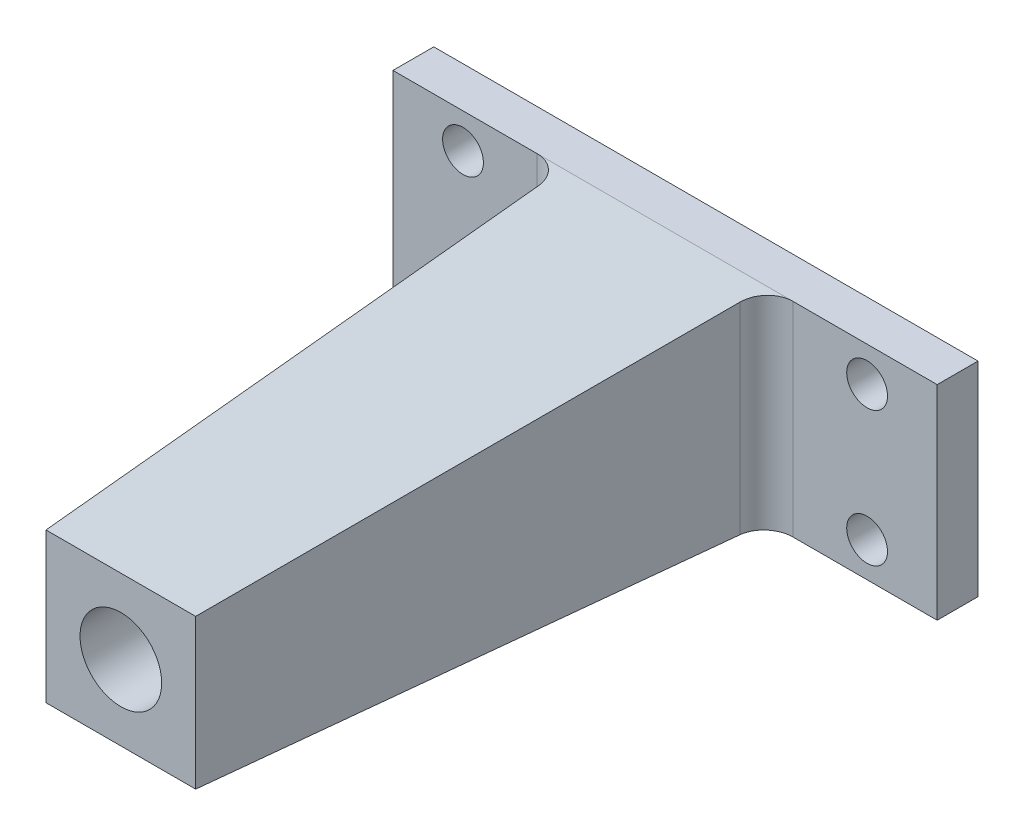
ISO-10303-21;
HEADER;
FILE_DESCRIPTION(('STEP AP214'),'2;1');
FILE_NAME('part.step','',(''),(''),'','','');
FILE_SCHEMA(('AUTOMOTIVE_DESIGN { 1 0 10303 214 1 1 1 1 }'));
ENDSEC;
DATA;
#1=APPLICATION_CONTEXT('core data for automotive mechanical design processes');
#2=APPLICATION_PROTOCOL_DEFINITION('international standard','automotive_design',2000,#1);
#3=PRODUCT_CONTEXT('',#1,'mechanical');
#4=PRODUCT('Part','Part','',(#3));
#5=PRODUCT_RELATED_PRODUCT_CATEGORY('part','',(#4));
#6=PRODUCT_DEFINITION_FORMATION('','',#4);
#7=PRODUCT_DEFINITION_CONTEXT('part definition',#1,'design');
#8=PRODUCT_DEFINITION('design','',#6,#7);
#9=PRODUCT_DEFINITION_SHAPE('','',#8);
#10=(LENGTH_UNIT() NAMED_UNIT(*) SI_UNIT(.MILLI.,.METRE.));
#11=(NAMED_UNIT(*) PLANE_ANGLE_UNIT() SI_UNIT($,.RADIAN.));
#12=(NAMED_UNIT(*) SI_UNIT($,.STERADIAN.) SOLID_ANGLE_UNIT());
#13=UNCERTAINTY_MEASURE_WITH_UNIT(LENGTH_MEASURE(1.E-05),#10,'distance_accuracy_value','');
#14=(GEOMETRIC_REPRESENTATION_CONTEXT(3) GLOBAL_UNCERTAINTY_ASSIGNED_CONTEXT((#13)) GLOBAL_UNIT_ASSIGNED_CONTEXT((#10,
#11,#12)) REPRESENTATION_CONTEXT('',''));
#15=CARTESIAN_POINT('',(0.,0.,0.));
#16=DIRECTION('',(0.,0.,1.));
#17=DIRECTION('',(1.,0.,0.));
#18=AXIS2_PLACEMENT_3D('',#15,#16,#17);
#19=CARTESIAN_POINT('',(0.,0.,3.));
#20=DIRECTION('',(0.,0.,-1.));
#21=DIRECTION('',(-1.,0.,0.));
#22=AXIS2_PLACEMENT_3D('',#19,#20,#21);
#23=PLANE('',#22);
#24=CARTESIAN_POINT('',(14.8489898729813,4.94949493640241,3.));
#25=DIRECTION('',(0.,0.,-1.));
#26=DIRECTION('',(-1.,0.,0.));
#27=AXIS2_PLACEMENT_3D('',#24,#25,#26);
#28=CIRCLE('',#27,1.5);
#29=CARTESIAN_POINT('',(13.3489898729813,4.94949493640241,3.));
#30=VERTEX_POINT('',#29);
#31=EDGE_CURVE('E708',#30,#30,#28,.T.);
#32=ORIENTED_EDGE('',*,*,#31,.T.);
#33=EDGE_LOOP('',(#32));
#34=FACE_BOUND('',#33,.T.);
#35=CARTESIAN_POINT('',(14.8489898729813,-4.95000000020931,3.));
#36=DIRECTION('',(0.,0.,-1.));
#37=DIRECTION('',(-1.,0.,0.));
#38=AXIS2_PLACEMENT_3D('',#35,#36,#37);
#39=CIRCLE('',#38,1.5);
#40=CARTESIAN_POINT('',(13.3489898729813,-4.95000000020931,3.));
#41=VERTEX_POINT('',#40);
#42=EDGE_CURVE('E717',#41,#41,#39,.T.);
#43=ORIENTED_EDGE('',*,*,#42,.T.);
#44=EDGE_LOOP('',(#43));
#45=FACE_BOUND('',#44,.T.);
#46=DIRECTION('',(-1.,0.,0.));
#47=VECTOR('',#46,1.);
#48=CARTESIAN_POINT('',(-20.,7.5,3.));
#49=LINE('',#48,#47);
#50=CARTESIAN_POINT('',(20.,7.5,3.));
#51=VERTEX_POINT('',#50);
#52=CARTESIAN_POINT('',(9.40249843945008,7.5,3.));
#53=VERTEX_POINT('',#52);
#54=EDGE_CURVE('E233',#51,#53,#49,.T.);
#55=ORIENTED_EDGE('',*,*,#54,.T.);
#56=DIRECTION('',(0.,1.,0.));
#57=VECTOR('',#56,1.);
#58=CARTESIAN_POINT('',(9.40249843945008,0.,3.));
#59=LINE('',#58,#57);
#60=CARTESIAN_POINT('',(9.40249843945008,-7.5,3.));
#61=VERTEX_POINT('',#60);
#62=EDGE_CURVE('E252',#53,#61,#59,.F.);
#63=ORIENTED_EDGE('',*,*,#62,.T.);
#64=DIRECTION('',(1.,0.,0.));
#65=VECTOR('',#64,1.);
#66=CARTESIAN_POINT('',(-20.,-7.5,3.));
#67=LINE('',#66,#65);
#68=CARTESIAN_POINT('',(20.,-7.5,3.));
#69=VERTEX_POINT('',#68);
#70=EDGE_CURVE('E242',#61,#69,#67,.T.);
#71=ORIENTED_EDGE('',*,*,#70,.T.);
#72=DIRECTION('',(0.,1.,0.));
#73=VECTOR('',#72,1.);
#74=CARTESIAN_POINT('',(20.,-7.5,3.));
#75=LINE('',#74,#73);
#76=EDGE_CURVE('E219',#69,#51,#75,.T.);
#77=ORIENTED_EDGE('',*,*,#76,.T.);
#78=EDGE_LOOP('',(#55,#63,#71,#77));
#79=FACE_BOUND('',#78,.T.);
#80=ADVANCED_FACE('F48',(#34,#45,#79),#23,.F.);
#81=CARTESIAN_POINT('',(-14.8494949368536,-4.9500000002094,3.));
#82=DIRECTION('',(0.,0.,-1.));
#83=DIRECTION('',(-1.,0.,0.));
#84=AXIS2_PLACEMENT_3D('',#81,#82,#83);
#85=CIRCLE('',#84,1.5);
#86=CARTESIAN_POINT('',(-16.3494949368536,-4.9500000002094,3.));
#87=VERTEX_POINT('',#86);
#88=EDGE_CURVE('E702',#87,#87,#85,.T.);
#89=ORIENTED_EDGE('',*,*,#88,.T.);
#90=EDGE_LOOP('',(#89));
#91=FACE_BOUND('',#90,.T.);
#92=CARTESIAN_POINT('',(-14.8494949368536,4.94949493640231,3.));
#93=DIRECTION('',(0.,0.,-1.));
#94=DIRECTION('',(-1.,0.,0.));
#95=AXIS2_PLACEMENT_3D('',#92,#93,#94);
#96=CIRCLE('',#95,1.49999999999999);
#97=CARTESIAN_POINT('',(-16.3494949368536,4.94949493640231,3.));
#98=VERTEX_POINT('',#97);
#99=EDGE_CURVE('E704',#98,#98,#96,.T.);
#100=ORIENTED_EDGE('',*,*,#99,.T.);
#101=EDGE_LOOP('',(#100));
#102=FACE_BOUND('',#101,.T.);
#103=CARTESIAN_POINT('',(-20.,-7.5,3.));
#104=VERTEX_POINT('',#103);
#105=CARTESIAN_POINT('',(-9.40249843945008,-7.5,3.));
#106=VERTEX_POINT('',#105);
#107=EDGE_CURVE('E239',#104,#106,#67,.T.);
#108=ORIENTED_EDGE('',*,*,#107,.T.);
#109=DIRECTION('',(0.,-1.,0.));
#110=VECTOR('',#109,1.);
#111=CARTESIAN_POINT('',(-9.40249843945008,0.,3.));
#112=LINE('',#111,#110);
#113=CARTESIAN_POINT('',(-9.40249843945008,7.5,3.));
#114=VERTEX_POINT('',#113);
#115=EDGE_CURVE('E256',#106,#114,#112,.F.);
#116=ORIENTED_EDGE('',*,*,#115,.T.);
#117=CARTESIAN_POINT('',(-20.,7.5,3.));
#118=VERTEX_POINT('',#117);
#119=EDGE_CURVE('E222',#114,#118,#49,.T.);
#120=ORIENTED_EDGE('',*,*,#119,.T.);
#121=DIRECTION('',(0.,-1.,0.));
#122=VECTOR('',#121,1.);
#123=CARTESIAN_POINT('',(-20.,-7.5,3.));
#124=LINE('',#123,#122);
#125=EDGE_CURVE('E226',#118,#104,#124,.T.);
#126=ORIENTED_EDGE('',*,*,#125,.T.);
#127=EDGE_LOOP('',(#108,#116,#120,#126));
#128=FACE_BOUND('',#127,.T.);
#129=ADVANCED_FACE('F358',(#91,#102,#128),#23,.F.);
#130=CARTESIAN_POINT('',(0.,0.,0.));
#131=DIRECTION('',(0.,0.,-1.));
#132=DIRECTION('',(-1.,0.,0.));
#133=AXIS2_PLACEMENT_3D('',#130,#131,#132);
#134=PLANE('',#133);
#135=CARTESIAN_POINT('',(-14.8494949368536,-4.9500000002094,0.));
#136=DIRECTION('',(0.,0.,-1.));
#137=DIRECTION('',(-1.,0.,0.));
#138=AXIS2_PLACEMENT_3D('',#135,#136,#137);
#139=CIRCLE('',#138,1.5);
#140=CARTESIAN_POINT('',(-16.3494949368536,-4.9500000002094,0.));
#141=VERTEX_POINT('',#140);
#142=EDGE_CURVE('E699',#141,#141,#139,.T.);
#143=ORIENTED_EDGE('',*,*,#142,.F.);
#144=EDGE_LOOP('',(#143));
#145=FACE_BOUND('',#144,.T.);
#146=CARTESIAN_POINT('',(-14.8494949368536,4.94949493640231,0.));
#147=DIRECTION('',(0.,0.,-1.));
#148=DIRECTION('',(-1.,0.,0.));
#149=AXIS2_PLACEMENT_3D('',#146,#147,#148);
#150=CIRCLE('',#149,1.49999999999999);
#151=CARTESIAN_POINT('',(-16.3494949368536,4.94949493640231,0.));
#152=VERTEX_POINT('',#151);
#153=EDGE_CURVE('E725',#152,#152,#150,.T.);
#154=ORIENTED_EDGE('',*,*,#153,.F.);
#155=EDGE_LOOP('',(#154));
#156=FACE_BOUND('',#155,.T.);
#157=CARTESIAN_POINT('',(14.8489898729813,4.94949493640241,0.));
#158=DIRECTION('',(0.,0.,-1.));
#159=DIRECTION('',(-1.,0.,0.));
#160=AXIS2_PLACEMENT_3D('',#157,#158,#159);
#161=CIRCLE('',#160,1.5);
#162=CARTESIAN_POINT('',(13.3489898729813,4.94949493640241,0.));
#163=VERTEX_POINT('',#162);
#164=EDGE_CURVE('E723',#163,#163,#161,.T.);
#165=ORIENTED_EDGE('',*,*,#164,.F.);
#166=EDGE_LOOP('',(#165));
#167=FACE_BOUND('',#166,.T.);
#168=CARTESIAN_POINT('',(14.8489898729813,-4.95000000020931,0.));
#169=DIRECTION('',(0.,0.,-1.));
#170=DIRECTION('',(-1.,0.,0.));
#171=AXIS2_PLACEMENT_3D('',#168,#169,#170);
#172=CIRCLE('',#171,1.5);
#173=CARTESIAN_POINT('',(13.3489898729813,-4.95000000020931,0.));
#174=VERTEX_POINT('',#173);
#175=EDGE_CURVE('E720',#174,#174,#172,.T.);
#176=ORIENTED_EDGE('',*,*,#175,.F.);
#177=EDGE_LOOP('',(#176));
#178=FACE_BOUND('',#177,.T.);
#179=CARTESIAN_POINT('',(-4.95,-4.95,0.));
#180=DIRECTION('',(0.,0.,1.));
#181=DIRECTION('',(1.,0.,0.));
#182=AXIS2_PLACEMENT_3D('',#179,#180,#181);
#183=CIRCLE('',#182,1.5);
#184=CARTESIAN_POINT('',(-3.45,-4.95,0.));
#185=VERTEX_POINT('',#184);
#186=EDGE_CURVE('E209',#185,#185,#183,.T.);
#187=ORIENTED_EDGE('',*,*,#186,.T.);
#188=EDGE_LOOP('',(#187));
#189=FACE_BOUND('',#188,.T.);
#190=CARTESIAN_POINT('',(4.95,4.95,0.));
#191=DIRECTION('',(0.,0.,1.));
#192=DIRECTION('',(1.,0.,0.));
#193=AXIS2_PLACEMENT_3D('',#190,#191,#192);
#194=CIRCLE('',#193,1.5);
#195=CARTESIAN_POINT('',(6.45,4.95,0.));
#196=VERTEX_POINT('',#195);
#197=EDGE_CURVE('E215',#196,#196,#194,.T.);
#198=ORIENTED_EDGE('',*,*,#197,.T.);
#199=EDGE_LOOP('',(#198));
#200=FACE_BOUND('',#199,.T.);
#201=DIRECTION('',(0.,1.,0.));
#202=VECTOR('',#201,1.);
#203=CARTESIAN_POINT('',(20.,-7.5,0.));
#204=LINE('',#203,#202);
#205=CARTESIAN_POINT('',(20.,-7.5,0.));
#206=VERTEX_POINT('',#205);
#207=CARTESIAN_POINT('',(20.,7.5,0.));
#208=VERTEX_POINT('',#207);
#209=EDGE_CURVE('E218',#206,#208,#204,.T.);
#210=ORIENTED_EDGE('',*,*,#209,.F.);
#211=DIRECTION('',(1.,0.,0.));
#212=VECTOR('',#211,1.);
#213=CARTESIAN_POINT('',(-20.,-7.5,0.));
#214=LINE('',#213,#212);
#215=CARTESIAN_POINT('',(-20.,-7.5,0.));
#216=VERTEX_POINT('',#215);
#217=EDGE_CURVE('E223',#216,#206,#214,.T.);
#218=ORIENTED_EDGE('',*,*,#217,.F.);
#219=DIRECTION('',(0.,-1.,0.));
#220=VECTOR('',#219,1.);
#221=CARTESIAN_POINT('',(-20.,-7.5,0.));
#222=LINE('',#221,#220);
#223=CARTESIAN_POINT('',(-20.,7.5,0.));
#224=VERTEX_POINT('',#223);
#225=EDGE_CURVE('E344',#224,#216,#222,.T.);
#226=ORIENTED_EDGE('',*,*,#225,.F.);
#227=DIRECTION('',(-1.,0.,0.));
#228=VECTOR('',#227,1.);
#229=CARTESIAN_POINT('',(-20.,7.5,0.));
#230=LINE('',#229,#228);
#231=EDGE_CURVE('E345',#208,#224,#230,.T.);
#232=ORIENTED_EDGE('',*,*,#231,.F.);
#233=EDGE_LOOP('',(#210,#218,#226,#232));
#234=FACE_BOUND('',#233,.T.);
#235=CARTESIAN_POINT('',(4.95,-4.95,0.));
#236=DIRECTION('',(0.,0.,1.));
#237=DIRECTION('',(1.,0.,0.));
#238=AXIS2_PLACEMENT_3D('',#235,#236,#237);
#239=CIRCLE('',#238,1.5);
#240=CARTESIAN_POINT('',(6.45,-4.95,0.));
#241=VERTEX_POINT('',#240);
#242=EDGE_CURVE('E212',#241,#241,#239,.T.);
#243=ORIENTED_EDGE('',*,*,#242,.T.);
#244=EDGE_LOOP('',(#243));
#245=FACE_BOUND('',#244,.T.);
#246=CARTESIAN_POINT('',(-4.95,4.95,0.));
#247=DIRECTION('',(0.,0.,1.));
#248=DIRECTION('',(1.,0.,0.));
#249=AXIS2_PLACEMENT_3D('',#246,#247,#248);
#250=CIRCLE('',#249,1.5);
#251=CARTESIAN_POINT('',(-3.45,4.95,0.));
#252=VERTEX_POINT('',#251);
#253=EDGE_CURVE('E201',#252,#252,#250,.T.);
#254=ORIENTED_EDGE('',*,*,#253,.T.);
#255=EDGE_LOOP('',(#254));
#256=FACE_BOUND('',#255,.T.);
#257=ADVANCED_FACE('F353',(#145,#156,#167,#178,#189,#200,#234,#245,#256),#134,.T.);
#258=CARTESIAN_POINT('',(20.,-7.5,3.));
#259=DIRECTION('',(-1.,0.,0.));
#260=DIRECTION('',(0.,0.,1.));
#261=AXIS2_PLACEMENT_3D('',#258,#259,#260);
#262=PLANE('',#261);
#263=ORIENTED_EDGE('',*,*,#209,.T.);
#264=DIRECTION('',(0.,0.,-1.));
#265=VECTOR('',#264,1.);
#266=CARTESIAN_POINT('',(20.,7.5,3.));
#267=LINE('',#266,#265);
#268=EDGE_CURVE('E237',#51,#208,#267,.T.);
#269=ORIENTED_EDGE('',*,*,#268,.F.);
#270=ORIENTED_EDGE('',*,*,#76,.F.);
#271=DIRECTION('',(0.,0.,-1.));
#272=VECTOR('',#271,1.);
#273=CARTESIAN_POINT('',(20.,-7.5,3.));
#274=LINE('',#273,#272);
#275=EDGE_CURVE('E241',#69,#206,#274,.T.);
#276=ORIENTED_EDGE('',*,*,#275,.T.);
#277=EDGE_LOOP('',(#263,#269,#270,#276));
#278=FACE_BOUND('',#277,.T.);
#279=ADVANCED_FACE('F348',(#278),#262,.F.);
#280=CARTESIAN_POINT('',(-20.,7.5,3.));
#281=DIRECTION('',(0.,-1.,0.));
#282=DIRECTION('',(0.,0.,-1.));
#283=AXIS2_PLACEMENT_3D('',#280,#281,#282);
#284=PLANE('',#283);
#285=ORIENTED_EDGE('',*,*,#231,.T.);
#286=DIRECTION('',(0.,0.,-1.));
#287=VECTOR('',#286,1.);
#288=CARTESIAN_POINT('',(-20.,7.5,3.));
#289=LINE('',#288,#287);
#290=EDGE_CURVE('E328',#118,#224,#289,.T.);
#291=ORIENTED_EDGE('',*,*,#290,.F.);
#292=ORIENTED_EDGE('',*,*,#119,.F.);
#293=DIRECTION('',(-1.,0.,0.));
#294=VECTOR('',#293,1.);
#295=CARTESIAN_POINT('',(-7.5,7.5,3.));
#296=LINE('',#295,#294);
#297=EDGE_CURVE('E132',#53,#114,#296,.T.);
#298=ORIENTED_EDGE('',*,*,#297,.F.);
#299=ORIENTED_EDGE('',*,*,#54,.F.);
#300=ORIENTED_EDGE('',*,*,#268,.T.);
#301=EDGE_LOOP('',(#285,#291,#292,#298,#299,#300));
#302=FACE_BOUND('',#301,.T.);
#303=ADVANCED_FACE('F359',(#302),#284,.F.);
#304=CARTESIAN_POINT('',(-20.,-7.5,3.));
#305=DIRECTION('',(1.,0.,0.));
#306=DIRECTION('',(0.,0.,-1.));
#307=AXIS2_PLACEMENT_3D('',#304,#305,#306);
#308=PLANE('',#307);
#309=ORIENTED_EDGE('',*,*,#225,.T.);
#310=DIRECTION('',(0.,0.,-1.));
#311=VECTOR('',#310,1.);
#312=CARTESIAN_POINT('',(-20.,-7.5,3.));
#313=LINE('',#312,#311);
#314=EDGE_CURVE('E333',#104,#216,#313,.T.);
#315=ORIENTED_EDGE('',*,*,#314,.F.);
#316=ORIENTED_EDGE('',*,*,#125,.F.);
#317=ORIENTED_EDGE('',*,*,#290,.T.);
#318=EDGE_LOOP('',(#309,#315,#316,#317));
#319=FACE_BOUND('',#318,.T.);
#320=ADVANCED_FACE('F356',(#319),#308,.F.);
#321=CARTESIAN_POINT('',(-20.,-7.5,3.));
#322=DIRECTION('',(0.,1.,0.));
#323=DIRECTION('',(0.,0.,1.));
#324=AXIS2_PLACEMENT_3D('',#321,#322,#323);
#325=PLANE('',#324);
#326=ORIENTED_EDGE('',*,*,#217,.T.);
#327=ORIENTED_EDGE('',*,*,#275,.F.);
#328=ORIENTED_EDGE('',*,*,#70,.F.);
#329=DIRECTION('',(1.,0.,0.));
#330=VECTOR('',#329,1.);
#331=CARTESIAN_POINT('',(-7.5,-7.5,3.));
#332=LINE('',#331,#330);
#333=EDGE_CURVE('E64',#106,#61,#332,.T.);
#334=ORIENTED_EDGE('',*,*,#333,.F.);
#335=ORIENTED_EDGE('',*,*,#107,.F.);
#336=ORIENTED_EDGE('',*,*,#314,.T.);
#337=EDGE_LOOP('',(#326,#327,#328,#334,#335,#336));
#338=FACE_BOUND('',#337,.T.);
#339=ADVANCED_FACE('F357',(#338),#325,.F.);
#340=CARTESIAN_POINT('',(4.95,4.95,3.));
#341=DIRECTION('',(0.,0.,-1.));
#342=DIRECTION('',(-1.,0.,0.));
#343=AXIS2_PLACEMENT_3D('',#340,#341,#342);
#344=CYLINDRICAL_SURFACE('',#343,1.5);
#345=ORIENTED_EDGE('',*,*,#197,.F.);
#346=EDGE_LOOP('',(#345));
#347=FACE_BOUND('',#346,.T.);
#348=CARTESIAN_POINT('',(4.95,4.95,8.));
#349=DIRECTION('',(0.,0.,-1.));
#350=DIRECTION('',(-1.,0.,0.));
#351=AXIS2_PLACEMENT_3D('',#348,#349,#350);
#352=CIRCLE('',#351,1.5);
#353=CARTESIAN_POINT('',(3.45,4.95,8.));
#354=VERTEX_POINT('',#353);
#355=EDGE_CURVE('E399',#354,#354,#352,.T.);
#356=ORIENTED_EDGE('',*,*,#355,.F.);
#357=EDGE_LOOP('',(#356));
#358=FACE_BOUND('',#357,.T.);
#359=ADVANCED_FACE('F379',(#347,#358),#344,.F.);
#360=CARTESIAN_POINT('',(4.95,-4.95,3.));
#361=DIRECTION('',(0.,0.,-1.));
#362=DIRECTION('',(-1.,0.,0.));
#363=AXIS2_PLACEMENT_3D('',#360,#361,#362);
#364=CYLINDRICAL_SURFACE('',#363,1.5);
#365=ORIENTED_EDGE('',*,*,#242,.F.);
#366=EDGE_LOOP('',(#365));
#367=FACE_BOUND('',#366,.T.);
#368=CARTESIAN_POINT('',(4.95,-4.95,8.));
#369=DIRECTION('',(0.,0.,-1.));
#370=DIRECTION('',(-1.,0.,0.));
#371=AXIS2_PLACEMENT_3D('',#368,#369,#370);
#372=CIRCLE('',#371,1.5);
#373=CARTESIAN_POINT('',(3.45,-4.95,8.));
#374=VERTEX_POINT('',#373);
#375=EDGE_CURVE('E402',#374,#374,#372,.T.);
#376=ORIENTED_EDGE('',*,*,#375,.F.);
#377=EDGE_LOOP('',(#376));
#378=FACE_BOUND('',#377,.T.);
#379=ADVANCED_FACE('F388',(#367,#378),#364,.F.);
#380=CARTESIAN_POINT('',(-4.95,-4.95,3.));
#381=DIRECTION('',(0.,0.,-1.));
#382=DIRECTION('',(-1.,0.,0.));
#383=AXIS2_PLACEMENT_3D('',#380,#381,#382);
#384=CYLINDRICAL_SURFACE('',#383,1.5);
#385=ORIENTED_EDGE('',*,*,#186,.F.);
#386=EDGE_LOOP('',(#385));
#387=FACE_BOUND('',#386,.T.);
#388=CARTESIAN_POINT('',(-4.95,-4.95,8.));
#389=DIRECTION('',(0.,0.,-1.));
#390=DIRECTION('',(-1.,0.,0.));
#391=AXIS2_PLACEMENT_3D('',#388,#389,#390);
#392=CIRCLE('',#391,1.5);
#393=CARTESIAN_POINT('',(-6.45,-4.95,8.));
#394=VERTEX_POINT('',#393);
#395=EDGE_CURVE('E405',#394,#394,#392,.T.);
#396=ORIENTED_EDGE('',*,*,#395,.F.);
#397=EDGE_LOOP('',(#396));
#398=FACE_BOUND('',#397,.T.);
#399=ADVANCED_FACE('F393',(#387,#398),#384,.F.);
#400=CARTESIAN_POINT('',(-4.95,4.95,3.));
#401=DIRECTION('',(0.,0.,-1.));
#402=DIRECTION('',(-1.,0.,0.));
#403=AXIS2_PLACEMENT_3D('',#400,#401,#402);
#404=CYLINDRICAL_SURFACE('',#403,1.5);
#405=ORIENTED_EDGE('',*,*,#253,.F.);
#406=EDGE_LOOP('',(#405));
#407=FACE_BOUND('',#406,.T.);
#408=CARTESIAN_POINT('',(-4.95,4.95,8.));
#409=DIRECTION('',(0.,0.,-1.));
#410=DIRECTION('',(-1.,0.,0.));
#411=AXIS2_PLACEMENT_3D('',#408,#409,#410);
#412=CIRCLE('',#411,1.5);
#413=CARTESIAN_POINT('',(-6.45,4.95,8.));
#414=VERTEX_POINT('',#413);
#415=EDGE_CURVE('E401',#414,#414,#412,.T.);
#416=ORIENTED_EDGE('',*,*,#415,.F.);
#417=EDGE_LOOP('',(#416));
#418=FACE_BOUND('',#417,.T.);
#419=ADVANCED_FACE('F417',(#407,#418),#404,.F.);
#420=CARTESIAN_POINT('',(0.,7.63092269326683,0.381546134663342));
#421=DIRECTION('',(0.,0.998752338877845,0.0499376169438922));
#422=DIRECTION('',(0.,-0.0499376169438922,0.998752338877845));
#423=AXIS2_PLACEMENT_3D('',#420,#421,#422);
#424=PLANE('',#423);
#425=DIRECTION('',(0.0498754668053816,0.0498754668053816,-0.997509336107633));
#426=VECTOR('',#425,1.);
#427=CARTESIAN_POINT('',(5.5,5.5,43.));
#428=LINE('',#427,#426);
#429=CARTESIAN_POINT('',(5.5,5.5,43.));
#430=VERTEX_POINT('',#429);
#431=CARTESIAN_POINT('',(7.40499376169439,7.40499376169439,4.90012476611222));
#432=VERTEX_POINT('',#431);
#433=EDGE_CURVE('E120',#430,#432,#428,.T.);
#434=ORIENTED_EDGE('',*,*,#433,.T.);
#435=CARTESIAN_POINT('',(9.40249843945008,7.4,5.));
#436=DIRECTION('',(0.,0.998752338877845,0.0499376169438922));
#437=DIRECTION('',(0.,0.0499376169438922,-0.998752338877845));
#438=AXIS2_PLACEMENT_3D('',#435,#436,#437);
#439=ELLIPSE('',#438,2.00249843945008,2.);
#440=EDGE_CURVE('E262',#432,#53,#439,.F.);
#441=ORIENTED_EDGE('',*,*,#440,.T.);
#442=ORIENTED_EDGE('',*,*,#297,.T.);
#443=CARTESIAN_POINT('',(-9.40249843945008,7.4,5.));
#444=DIRECTION('',(0.,0.998752338877845,0.0499376169438922));
#445=DIRECTION('',(0.,-0.0499376169438922,0.998752338877845));
#446=AXIS2_PLACEMENT_3D('',#443,#444,#445);
#447=ELLIPSE('',#446,2.00249843945008,2.);
#448=CARTESIAN_POINT('',(-7.40499376169439,7.40499376169439,4.90012476611222));
#449=VERTEX_POINT('',#448);
#450=EDGE_CURVE('E12',#114,#449,#447,.F.);
#451=ORIENTED_EDGE('',*,*,#450,.T.);
#452=DIRECTION('',(-0.0498754668053816,0.0498754668053816,-0.997509336107633));
#453=VECTOR('',#452,1.);
#454=CARTESIAN_POINT('',(-5.5,5.5,43.));
#455=LINE('',#454,#453);
#456=CARTESIAN_POINT('',(-5.5,5.5,43.));
#457=VERTEX_POINT('',#456);
#458=EDGE_CURVE('E133',#457,#449,#455,.T.);
#459=ORIENTED_EDGE('',*,*,#458,.F.);
#460=DIRECTION('',(-1.,0.,0.));
#461=VECTOR('',#460,1.);
#462=CARTESIAN_POINT('',(5.5,5.5,43.));
#463=LINE('',#462,#461);
#464=EDGE_CURVE('E136',#430,#457,#463,.T.);
#465=ORIENTED_EDGE('',*,*,#464,.F.);
#466=EDGE_LOOP('',(#434,#441,#442,#451,#459,#465));
#467=FACE_BOUND('',#466,.T.);
#468=ADVANCED_FACE('F138',(#467),#424,.T.);
#469=CARTESIAN_POINT('',(-7.63092269326684,0.,0.381546134663342));
#470=DIRECTION('',(-0.998752338877845,0.,0.0499376169438922));
#471=DIRECTION('',(0.0499376169438922,0.,0.998752338877845));
#472=AXIS2_PLACEMENT_3D('',#469,#470,#471);
#473=PLANE('',#472);
#474=ORIENTED_EDGE('',*,*,#458,.T.);
#475=DIRECTION('',(0.,-1.,0.));
#476=VECTOR('',#475,1.);
#477=CARTESIAN_POINT('',(-7.40499376169439,0.,4.90012476611222));
#478=LINE('',#477,#476);
#479=CARTESIAN_POINT('',(-7.40499376169439,-7.40499376169439,4.90012476611222));
#480=VERTEX_POINT('',#479);
#481=EDGE_CURVE('E254',#449,#480,#478,.T.);
#482=ORIENTED_EDGE('',*,*,#481,.T.);
#483=DIRECTION('',(-0.0498754668053816,-0.0498754668053816,-0.997509336107633));
#484=VECTOR('',#483,1.);
#485=CARTESIAN_POINT('',(-5.5,-5.5,43.));
#486=LINE('',#485,#484);
#487=CARTESIAN_POINT('',(-5.5,-5.5,43.));
#488=VERTEX_POINT('',#487);
#489=EDGE_CURVE('E144',#488,#480,#486,.T.);
#490=ORIENTED_EDGE('',*,*,#489,.F.);
#491=DIRECTION('',(0.,-1.,0.));
#492=VECTOR('',#491,1.);
#493=CARTESIAN_POINT('',(-5.5,5.5,43.));
#494=LINE('',#493,#492);
#495=EDGE_CURVE('E196',#457,#488,#494,.T.);
#496=ORIENTED_EDGE('',*,*,#495,.F.);
#497=EDGE_LOOP('',(#474,#482,#490,#496));
#498=FACE_BOUND('',#497,.T.);
#499=ADVANCED_FACE('F274',(#498),#473,.T.);
#500=CARTESIAN_POINT('',(7.63092269326684,0.,0.381546134663342));
#501=DIRECTION('',(0.998752338877845,0.,0.0499376169438922));
#502=DIRECTION('',(0.0499376169438922,0.,-0.998752338877845));
#503=AXIS2_PLACEMENT_3D('',#500,#501,#502);
#504=PLANE('',#503);
#505=DIRECTION('',(0.0498754668053816,-0.0498754668053816,-0.997509336107633));
#506=VECTOR('',#505,1.);
#507=CARTESIAN_POINT('',(5.5,-5.5,43.));
#508=LINE('',#507,#506);
#509=CARTESIAN_POINT('',(5.5,-5.5,43.));
#510=VERTEX_POINT('',#509);
#511=CARTESIAN_POINT('',(7.40499376169439,-7.40499376169439,4.90012476611222));
#512=VERTEX_POINT('',#511);
#513=EDGE_CURVE('E276',#510,#512,#508,.T.);
#514=ORIENTED_EDGE('',*,*,#513,.T.);
#515=DIRECTION('',(0.,1.,0.));
#516=VECTOR('',#515,1.);
#517=CARTESIAN_POINT('',(7.40499376169439,0.,4.90012476611222));
#518=LINE('',#517,#516);
#519=EDGE_CURVE('E129',#512,#432,#518,.T.);
#520=ORIENTED_EDGE('',*,*,#519,.T.);
#521=ORIENTED_EDGE('',*,*,#433,.F.);
#522=DIRECTION('',(0.,1.,0.));
#523=VECTOR('',#522,1.);
#524=CARTESIAN_POINT('',(5.5,-5.5,43.));
#525=LINE('',#524,#523);
#526=EDGE_CURVE('E125',#510,#430,#525,.T.);
#527=ORIENTED_EDGE('',*,*,#526,.F.);
#528=EDGE_LOOP('',(#514,#520,#521,#527));
#529=FACE_BOUND('',#528,.T.);
#530=ADVANCED_FACE('F123',(#529),#504,.T.);
#531=CARTESIAN_POINT('',(0.,-7.63092269326684,0.381546134663342));
#532=DIRECTION('',(0.,-0.998752338877845,0.0499376169438922));
#533=DIRECTION('',(0.,-0.0499376169438922,-0.998752338877845));
#534=AXIS2_PLACEMENT_3D('',#531,#532,#533);
#535=PLANE('',#534);
#536=ORIENTED_EDGE('',*,*,#489,.T.);
#537=CARTESIAN_POINT('',(-9.40249843945008,-7.4,5.));
#538=DIRECTION('',(0.,-0.998752338877845,0.0499376169438922));
#539=DIRECTION('',(0.,-0.0499376169438922,-0.998752338877845));
#540=AXIS2_PLACEMENT_3D('',#537,#538,#539);
#541=ELLIPSE('',#540,2.00249843945008,2.);
#542=EDGE_CURVE('E57',#480,#106,#541,.F.);
#543=ORIENTED_EDGE('',*,*,#542,.T.);
#544=ORIENTED_EDGE('',*,*,#333,.T.);
#545=CARTESIAN_POINT('',(9.40249843945008,-7.4,5.));
#546=DIRECTION('',(0.,-0.998752338877845,0.0499376169438922));
#547=DIRECTION('',(0.,0.0499376169438922,0.998752338877845));
#548=AXIS2_PLACEMENT_3D('',#545,#546,#547);
#549=ELLIPSE('',#548,2.00249843945008,2.);
#550=EDGE_CURVE('E266',#61,#512,#549,.F.);
#551=ORIENTED_EDGE('',*,*,#550,.T.);
#552=ORIENTED_EDGE('',*,*,#513,.F.);
#553=DIRECTION('',(1.,0.,0.));
#554=VECTOR('',#553,1.);
#555=CARTESIAN_POINT('',(-5.5,-5.5,43.));
#556=LINE('',#555,#554);
#557=EDGE_CURVE('E151',#488,#510,#556,.T.);
#558=ORIENTED_EDGE('',*,*,#557,.F.);
#559=EDGE_LOOP('',(#536,#543,#544,#551,#552,#558));
#560=FACE_BOUND('',#559,.T.);
#561=ADVANCED_FACE('F172',(#560),#535,.T.);
#562=CARTESIAN_POINT('',(0.,0.,43.));
#563=DIRECTION('',(0.,0.,1.));
#564=DIRECTION('',(1.,0.,0.));
#565=AXIS2_PLACEMENT_3D('',#562,#563,#564);
#566=PLANE('',#565);
#567=CARTESIAN_POINT('',(0.,0.,43.));
#568=DIRECTION('',(0.,0.,1.));
#569=DIRECTION('',(1.,0.,0.));
#570=AXIS2_PLACEMENT_3D('',#567,#568,#569);
#571=CIRCLE('',#570,2.99964286625281);
#572=CARTESIAN_POINT('',(2.99964286625281,0.,43.));
#573=VERTEX_POINT('',#572);
#574=EDGE_CURVE('E703',#573,#573,#571,.T.);
#575=ORIENTED_EDGE('',*,*,#574,.F.);
#576=EDGE_LOOP('',(#575));
#577=FACE_BOUND('',#576,.T.);
#578=ORIENTED_EDGE('',*,*,#495,.T.);
#579=ORIENTED_EDGE('',*,*,#557,.T.);
#580=ORIENTED_EDGE('',*,*,#526,.T.);
#581=ORIENTED_EDGE('',*,*,#464,.T.);
#582=EDGE_LOOP('',(#578,#579,#580,#581));
#583=FACE_BOUND('',#582,.T.);
#584=ADVANCED_FACE('F150',(#577,#583),#566,.T.);
#585=CARTESIAN_POINT('',(4.95,4.95,8.));
#586=DIRECTION('',(0.,0.,-1.));
#587=DIRECTION('',(-1.,0.,0.));
#588=AXIS2_PLACEMENT_3D('',#585,#586,#587);
#589=PLANE('',#588);
#590=ORIENTED_EDGE('',*,*,#355,.T.);
#591=EDGE_LOOP('',(#590));
#592=FACE_BOUND('',#591,.T.);
#593=ADVANCED_FACE('F171',(#592),#589,.T.);
#594=CARTESIAN_POINT('',(4.95,-4.95,8.));
#595=DIRECTION('',(0.,0.,-1.));
#596=DIRECTION('',(-1.,0.,0.));
#597=AXIS2_PLACEMENT_3D('',#594,#595,#596);
#598=PLANE('',#597);
#599=ORIENTED_EDGE('',*,*,#375,.T.);
#600=EDGE_LOOP('',(#599));
#601=FACE_BOUND('',#600,.T.);
#602=ADVANCED_FACE('F445',(#601),#598,.T.);
#603=CARTESIAN_POINT('',(-4.95,-4.95,8.));
#604=DIRECTION('',(0.,0.,-1.));
#605=DIRECTION('',(-1.,0.,0.));
#606=AXIS2_PLACEMENT_3D('',#603,#604,#605);
#607=PLANE('',#606);
#608=ORIENTED_EDGE('',*,*,#395,.T.);
#609=EDGE_LOOP('',(#608));
#610=FACE_BOUND('',#609,.T.);
#611=ADVANCED_FACE('F174',(#610),#607,.T.);
#612=CARTESIAN_POINT('',(-4.95,4.95,8.));
#613=DIRECTION('',(0.,0.,-1.));
#614=DIRECTION('',(-1.,0.,0.));
#615=AXIS2_PLACEMENT_3D('',#612,#613,#614);
#616=PLANE('',#615);
#617=ORIENTED_EDGE('',*,*,#415,.T.);
#618=EDGE_LOOP('',(#617));
#619=FACE_BOUND('',#618,.T.);
#620=ADVANCED_FACE('F434',(#619),#616,.T.);
#621=CARTESIAN_POINT('',(0.,0.,28.));
#622=DIRECTION('',(0.,0.,1.));
#623=DIRECTION('',(1.,0.,0.));
#624=AXIS2_PLACEMENT_3D('',#621,#622,#623);
#625=CYLINDRICAL_SURFACE('',#624,2.99964286625281);
#626=CARTESIAN_POINT('',(0.,0.,28.));
#627=DIRECTION('',(0.,0.,1.));
#628=DIRECTION('',(1.,0.,0.));
#629=AXIS2_PLACEMENT_3D('',#626,#627,#628);
#630=CIRCLE('',#629,2.99964286625281);
#631=CARTESIAN_POINT('',(2.99964286625281,0.,28.));
#632=VERTEX_POINT('',#631);
#633=EDGE_CURVE('E408',#632,#632,#630,.T.);
#634=ORIENTED_EDGE('',*,*,#633,.F.);
#635=EDGE_LOOP('',(#634));
#636=FACE_BOUND('',#635,.T.);
#637=ORIENTED_EDGE('',*,*,#574,.T.);
#638=EDGE_LOOP('',(#637));
#639=FACE_BOUND('',#638,.T.);
#640=ADVANCED_FACE('F436',(#636,#639),#625,.F.);
#641=CARTESIAN_POINT('',(0.,0.,28.));
#642=DIRECTION('',(0.,0.,1.));
#643=DIRECTION('',(1.,0.,0.));
#644=AXIS2_PLACEMENT_3D('',#641,#642,#643);
#645=PLANE('',#644);
#646=ORIENTED_EDGE('',*,*,#633,.T.);
#647=EDGE_LOOP('',(#646));
#648=FACE_BOUND('',#647,.T.);
#649=ADVANCED_FACE('F442',(#648),#645,.T.);
#650=CARTESIAN_POINT('',(14.8489898729813,-4.95000000020931,15.));
#651=DIRECTION('',(0.,0.,-1.));
#652=DIRECTION('',(-1.,0.,0.));
#653=AXIS2_PLACEMENT_3D('',#650,#651,#652);
#654=CYLINDRICAL_SURFACE('',#653,1.5);
#655=ORIENTED_EDGE('',*,*,#175,.T.);
#656=EDGE_LOOP('',(#655));
#657=FACE_BOUND('',#656,.T.);
#658=ORIENTED_EDGE('',*,*,#42,.F.);
#659=EDGE_LOOP('',(#658));
#660=FACE_BOUND('',#659,.T.);
#661=ADVANCED_FACE('F493',(#657,#660),#654,.F.);
#662=CARTESIAN_POINT('',(14.8489898729813,4.94949493640241,15.));
#663=DIRECTION('',(0.,0.,-1.));
#664=DIRECTION('',(-1.,0.,0.));
#665=AXIS2_PLACEMENT_3D('',#662,#663,#664);
#666=CYLINDRICAL_SURFACE('',#665,1.5);
#667=ORIENTED_EDGE('',*,*,#164,.T.);
#668=EDGE_LOOP('',(#667));
#669=FACE_BOUND('',#668,.T.);
#670=ORIENTED_EDGE('',*,*,#31,.F.);
#671=EDGE_LOOP('',(#670));
#672=FACE_BOUND('',#671,.T.);
#673=ADVANCED_FACE('F512',(#669,#672),#666,.F.);
#674=CARTESIAN_POINT('',(-14.8494949368536,4.94949493640231,15.));
#675=DIRECTION('',(0.,0.,-1.));
#676=DIRECTION('',(-1.,0.,0.));
#677=AXIS2_PLACEMENT_3D('',#674,#675,#676);
#678=CYLINDRICAL_SURFACE('',#677,1.49999999999999);
#679=ORIENTED_EDGE('',*,*,#153,.T.);
#680=EDGE_LOOP('',(#679));
#681=FACE_BOUND('',#680,.T.);
#682=ORIENTED_EDGE('',*,*,#99,.F.);
#683=EDGE_LOOP('',(#682));
#684=FACE_BOUND('',#683,.T.);
#685=ADVANCED_FACE('F523',(#681,#684),#678,.F.);
#686=CARTESIAN_POINT('',(-14.8494949368536,-4.9500000002094,15.));
#687=DIRECTION('',(0.,0.,-1.));
#688=DIRECTION('',(-1.,0.,0.));
#689=AXIS2_PLACEMENT_3D('',#686,#687,#688);
#690=CYLINDRICAL_SURFACE('',#689,1.5);
#691=ORIENTED_EDGE('',*,*,#142,.T.);
#692=EDGE_LOOP('',(#691));
#693=FACE_BOUND('',#692,.T.);
#694=ORIENTED_EDGE('',*,*,#88,.F.);
#695=EDGE_LOOP('',(#694));
#696=FACE_BOUND('',#695,.T.);
#697=ADVANCED_FACE('F534',(#693,#696),#690,.F.);
#698=CARTESIAN_POINT('',(9.40249843945008,0.,5.));
#699=DIRECTION('',(0.,1.,0.));
#700=DIRECTION('',(0.,0.,1.));
#701=AXIS2_PLACEMENT_3D('',#698,#699,#700);
#702=CYLINDRICAL_SURFACE('',#701,2.);
#703=ORIENTED_EDGE('',*,*,#550,.F.);
#704=ORIENTED_EDGE('',*,*,#62,.F.);
#705=ORIENTED_EDGE('',*,*,#440,.F.);
#706=ORIENTED_EDGE('',*,*,#519,.F.);
#707=EDGE_LOOP('',(#703,#704,#705,#706));
#708=FACE_BOUND('',#707,.T.);
#709=ADVANCED_FACE('F325',(#708),#702,.F.);
#710=CARTESIAN_POINT('',(-9.40249843945008,0.,5.));
#711=DIRECTION('',(0.,-1.,0.));
#712=DIRECTION('',(0.,0.,-1.));
#713=AXIS2_PLACEMENT_3D('',#710,#711,#712);
#714=CYLINDRICAL_SURFACE('',#713,2.);
#715=ORIENTED_EDGE('',*,*,#450,.F.);
#716=ORIENTED_EDGE('',*,*,#115,.F.);
#717=ORIENTED_EDGE('',*,*,#542,.F.);
#718=ORIENTED_EDGE('',*,*,#481,.F.);
#719=EDGE_LOOP('',(#715,#716,#717,#718));
#720=FACE_BOUND('',#719,.T.);
#721=ADVANCED_FACE('F50',(#720),#714,.F.);
#722=CLOSED_SHELL('',(#80,#129,#257,#279,#303,#320,#339,#359,#379,#399,#419,#468,#499,#530,#561,
#584,#593,#602,#611,#620,#640,#649,#661,#673,#685,#697,#709,#721));
#723=MANIFOLD_SOLID_BREP('B2',#722);
#724=ADVANCED_BREP_SHAPE_REPRESENTATION('',(#18,#723),#14);
#725=SHAPE_DEFINITION_REPRESENTATION(#9,#724);
ENDSEC;
END-ISO-10303-21;
